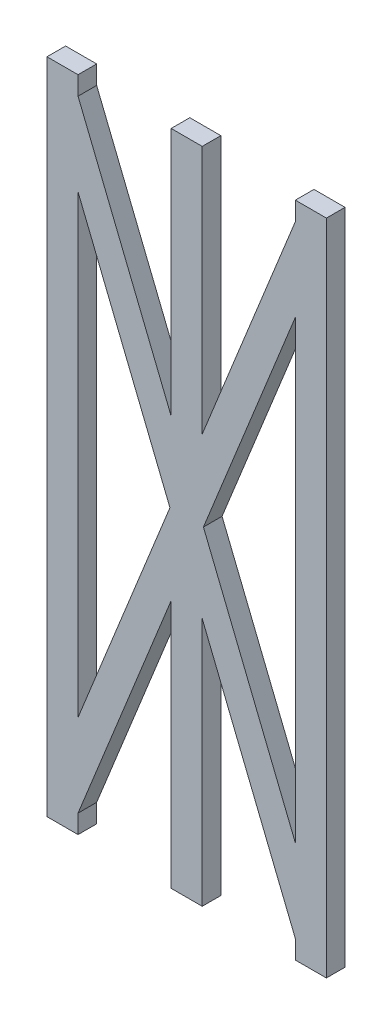
ISO-10303-21;
HEADER;
FILE_DESCRIPTION(('STEP AP214'),'2;1');
FILE_NAME('part.step','',(''),(''),'','','');
FILE_SCHEMA(('AUTOMOTIVE_DESIGN { 1 0 10303 214 1 1 1 1 }'));
ENDSEC;
DATA;
#1=APPLICATION_CONTEXT('core data for automotive mechanical design processes');
#2=APPLICATION_PROTOCOL_DEFINITION('international standard','automotive_design',2000,#1);
#3=PRODUCT_CONTEXT('',#1,'mechanical');
#4=PRODUCT('Part','Part','',(#3));
#5=PRODUCT_RELATED_PRODUCT_CATEGORY('part','',(#4));
#6=PRODUCT_DEFINITION_FORMATION('','',#4);
#7=PRODUCT_DEFINITION_CONTEXT('part definition',#1,'design');
#8=PRODUCT_DEFINITION('design','',#6,#7);
#9=PRODUCT_DEFINITION_SHAPE('','',#8);
#10=(LENGTH_UNIT() NAMED_UNIT(*) SI_UNIT(.MILLI.,.METRE.));
#11=(NAMED_UNIT(*) PLANE_ANGLE_UNIT() SI_UNIT($,.RADIAN.));
#12=(NAMED_UNIT(*) SI_UNIT($,.STERADIAN.) SOLID_ANGLE_UNIT());
#13=UNCERTAINTY_MEASURE_WITH_UNIT(LENGTH_MEASURE(1.E-05),#10,'distance_accuracy_value','');
#14=(GEOMETRIC_REPRESENTATION_CONTEXT(3) GLOBAL_UNCERTAINTY_ASSIGNED_CONTEXT((#13)) GLOBAL_UNIT_ASSIGNED_CONTEXT((#10,
#11,#12)) REPRESENTATION_CONTEXT('',''));
#15=CARTESIAN_POINT('',(0.,0.,0.));
#16=DIRECTION('',(0.,0.,1.));
#17=DIRECTION('',(1.,0.,0.));
#18=AXIS2_PLACEMENT_3D('',#15,#16,#17);
#19=CARTESIAN_POINT('',(35.4310171654556,14.3114678799665,3.));
#20=DIRECTION('',(0.927216502829253,0.374525775990239,0.));
#21=DIRECTION('',(-0.374525775990239,0.927216502829253,0.));
#22=AXIS2_PLACEMENT_3D('',#19,#20,#21);
#23=PLANE('',#22);
#24=DIRECTION('',(0.374525775990239,-0.927216502829253,0.));
#25=VECTOR('',#24,1.);
#26=CARTESIAN_POINT('',(35.4310171654556,14.3114678799665,0.));
#27=LINE('',#26,#25);
#28=CARTESIAN_POINT('',(5.00000000000001,89.6497840187898,0.));
#29=VERTEX_POINT('',#28);
#30=CARTESIAN_POINT('',(19.8037580841458,53.,0.));
#31=VERTEX_POINT('',#30);
#32=EDGE_CURVE('E222',#29,#31,#27,.T.);
#33=ORIENTED_EDGE('',*,*,#32,.T.);
#34=DIRECTION('',(0.,0.,-1.));
#35=VECTOR('',#34,1.);
#36=CARTESIAN_POINT('',(19.8037580841458,53.,3.));
#37=LINE('',#36,#35);
#38=CARTESIAN_POINT('',(19.8037580841458,53.,3.));
#39=VERTEX_POINT('',#38);
#40=EDGE_CURVE('E11',#39,#31,#37,.T.);
#41=ORIENTED_EDGE('',*,*,#40,.F.);
#42=DIRECTION('',(0.374525775990239,-0.927216502829253,0.));
#43=VECTOR('',#42,1.);
#44=CARTESIAN_POINT('',(35.4310171654556,14.3114678799665,3.));
#45=LINE('',#44,#43);
#46=CARTESIAN_POINT('',(5.00000000000001,89.6497840187898,3.));
#47=VERTEX_POINT('',#46);
#48=EDGE_CURVE('E214',#47,#39,#45,.T.);
#49=ORIENTED_EDGE('',*,*,#48,.F.);
#50=DIRECTION('',(0.,0.,-1.));
#51=VECTOR('',#50,1.);
#52=CARTESIAN_POINT('',(5.00000000000001,89.6497840187898,3.));
#53=LINE('',#52,#51);
#54=EDGE_CURVE('E54',#47,#29,#53,.T.);
#55=ORIENTED_EDGE('',*,*,#54,.T.);
#56=EDGE_LOOP('',(#33,#41,#49,#55));
#57=FACE_BOUND('',#56,.T.);
#58=ADVANCED_FACE('F35',(#57),#23,.F.);
#59=CARTESIAN_POINT('',(-1.37922973925097,0.557105149429064,3.));
#60=DIRECTION('',(-0.927216502829253,0.374525775990239,0.));
#61=DIRECTION('',(-0.374525775990239,-0.927216502829253,0.));
#62=AXIS2_PLACEMENT_3D('',#59,#60,#61);
#63=PLANE('',#62);
#64=DIRECTION('',(0.374525775990239,0.927216502829253,0.));
#65=VECTOR('',#64,1.);
#66=CARTESIAN_POINT('',(-1.37922973925097,0.557105149429064,0.));
#67=LINE('',#66,#65);
#68=CARTESIAN_POINT('',(5.00000000000001,16.3502159812102,0.));
#69=VERTEX_POINT('',#68);
#70=EDGE_CURVE('E296',#69,#31,#67,.T.);
#71=ORIENTED_EDGE('',*,*,#70,.F.);
#72=DIRECTION('',(0.,0.,-1.));
#73=VECTOR('',#72,1.);
#74=CARTESIAN_POINT('',(5.00000000000001,16.3502159812102,3.));
#75=LINE('',#74,#73);
#76=CARTESIAN_POINT('',(5.00000000000001,16.3502159812102,3.));
#77=VERTEX_POINT('',#76);
#78=EDGE_CURVE('E45',#77,#69,#75,.T.);
#79=ORIENTED_EDGE('',*,*,#78,.F.);
#80=DIRECTION('',(0.374525775990239,0.927216502829253,0.));
#81=VECTOR('',#80,1.);
#82=CARTESIAN_POINT('',(-1.37922973925097,0.557105149429064,3.));
#83=LINE('',#82,#81);
#84=EDGE_CURVE('E218',#77,#39,#83,.T.);
#85=ORIENTED_EDGE('',*,*,#84,.T.);
#86=ORIENTED_EDGE('',*,*,#40,.T.);
#87=EDGE_LOOP('',(#71,#79,#85,#86));
#88=FACE_BOUND('',#87,.T.);
#89=ADVANCED_FACE('F225',(#88),#63,.T.);
#90=CARTESIAN_POINT('',(40.0670996796019,16.1840967599177,3.));
#91=DIRECTION('',(0.927216502829253,0.374525775990239,0.));
#92=DIRECTION('',(-0.374525775990239,0.927216502829253,0.));
#93=AXIS2_PLACEMENT_3D('',#90,#91,#92);
#94=PLANE('',#93);
#95=DIRECTION('',(0.374525775990239,-0.927216502829253,0.));
#96=VECTOR('',#95,1.);
#97=CARTESIAN_POINT('',(40.0670996796019,16.1840967599177,0.));
#98=LINE('',#97,#96);
#99=CARTESIAN_POINT('',(25.1962419158542,53.,0.));
#100=VERTEX_POINT('',#99);
#101=CARTESIAN_POINT('',(40.,16.3502159812102,0.));
#102=VERTEX_POINT('',#101);
#103=EDGE_CURVE('E289',#100,#102,#98,.T.);
#104=ORIENTED_EDGE('',*,*,#103,.F.);
#105=DIRECTION('',(0.,0.,-1.));
#106=VECTOR('',#105,1.);
#107=CARTESIAN_POINT('',(25.1962419158542,53.,3.));
#108=LINE('',#107,#106);
#109=CARTESIAN_POINT('',(25.1962419158542,53.,3.));
#110=VERTEX_POINT('',#109);
#111=EDGE_CURVE('E299',#110,#100,#108,.T.);
#112=ORIENTED_EDGE('',*,*,#111,.F.);
#113=DIRECTION('',(0.374525775990239,-0.927216502829253,0.));
#114=VECTOR('',#113,1.);
#115=CARTESIAN_POINT('',(40.0670996796019,16.1840967599177,3.));
#116=LINE('',#115,#114);
#117=CARTESIAN_POINT('',(40.,16.3502159812102,3.));
#118=VERTEX_POINT('',#117);
#119=EDGE_CURVE('E409',#110,#118,#116,.T.);
#120=ORIENTED_EDGE('',*,*,#119,.T.);
#121=DIRECTION('',(0.,0.,-1.));
#122=VECTOR('',#121,1.);
#123=CARTESIAN_POINT('',(40.,16.3502159812102,3.));
#124=LINE('',#123,#122);
#125=EDGE_CURVE('E301',#118,#102,#124,.T.);
#126=ORIENTED_EDGE('',*,*,#125,.T.);
#127=EDGE_LOOP('',(#104,#112,#120,#126));
#128=FACE_BOUND('',#127,.T.);
#129=ADVANCED_FACE('F500',(#128),#94,.T.);
#130=CARTESIAN_POINT('',(3.2568527748953,-1.31552373052213,3.));
#131=DIRECTION('',(-0.927216502829252,0.374525775990239,0.));
#132=DIRECTION('',(-0.374525775990239,-0.927216502829253,0.));
#133=AXIS2_PLACEMENT_3D('',#130,#131,#132);
#134=PLANE('',#133);
#135=DIRECTION('',(0.374525775990239,0.927216502829253,0.));
#136=VECTOR('',#135,1.);
#137=CARTESIAN_POINT('',(3.2568527748953,-1.31552373052213,0.));
#138=LINE('',#137,#136);
#139=CARTESIAN_POINT('',(40.,89.6497840187898,0.));
#140=VERTEX_POINT('',#139);
#141=EDGE_CURVE('E292',#100,#140,#138,.T.);
#142=ORIENTED_EDGE('',*,*,#141,.T.);
#143=DIRECTION('',(0.,0.,-1.));
#144=VECTOR('',#143,1.);
#145=CARTESIAN_POINT('',(40.,89.6497840187898,3.));
#146=LINE('',#145,#144);
#147=CARTESIAN_POINT('',(40.,89.6497840187898,3.));
#148=VERTEX_POINT('',#147);
#149=EDGE_CURVE('E303',#148,#140,#146,.T.);
#150=ORIENTED_EDGE('',*,*,#149,.F.);
#151=DIRECTION('',(0.374525775990239,0.927216502829253,0.));
#152=VECTOR('',#151,1.);
#153=CARTESIAN_POINT('',(3.2568527748953,-1.31552373052213,3.));
#154=LINE('',#153,#152);
#155=EDGE_CURVE('E411',#110,#148,#154,.T.);
#156=ORIENTED_EDGE('',*,*,#155,.F.);
#157=ORIENTED_EDGE('',*,*,#111,.T.);
#158=EDGE_LOOP('',(#142,#150,#156,#157));
#159=FACE_BOUND('',#158,.T.);
#160=ADVANCED_FACE('F498',(#159),#134,.F.);
#161=CARTESIAN_POINT('',(40.,0.,3.));
#162=DIRECTION('',(-1.,0.,0.));
#163=DIRECTION('',(0.,0.,1.));
#164=AXIS2_PLACEMENT_3D('',#161,#162,#163);
#165=PLANE('',#164);
#166=DIRECTION('',(0.,1.,0.));
#167=VECTOR('',#166,1.);
#168=CARTESIAN_POINT('',(40.,0.,0.));
#169=LINE('',#168,#167);
#170=CARTESIAN_POINT('',(40.,103.,0.));
#171=VERTEX_POINT('',#170);
#172=CARTESIAN_POINT('',(40.,106.,0.));
#173=VERTEX_POINT('',#172);
#174=EDGE_CURVE('E233',#171,#173,#169,.T.);
#175=ORIENTED_EDGE('',*,*,#174,.F.);
#176=DIRECTION('',(0.,0.,-1.));
#177=VECTOR('',#176,1.);
#178=CARTESIAN_POINT('',(40.,103.,3.));
#179=LINE('',#178,#177);
#180=CARTESIAN_POINT('',(40.,103.,3.));
#181=VERTEX_POINT('',#180);
#182=EDGE_CURVE('E39',#181,#171,#179,.T.);
#183=ORIENTED_EDGE('',*,*,#182,.F.);
#184=DIRECTION('',(0.,1.,0.));
#185=VECTOR('',#184,1.);
#186=CARTESIAN_POINT('',(40.,0.,3.));
#187=LINE('',#186,#185);
#188=CARTESIAN_POINT('',(40.,106.,3.));
#189=VERTEX_POINT('',#188);
#190=EDGE_CURVE('E418',#181,#189,#187,.T.);
#191=ORIENTED_EDGE('',*,*,#190,.T.);
#192=DIRECTION('',(0.,0.,-1.));
#193=VECTOR('',#192,1.);
#194=CARTESIAN_POINT('',(40.,106.,3.));
#195=LINE('',#194,#193);
#196=EDGE_CURVE('E227',#189,#173,#195,.T.);
#197=ORIENTED_EDGE('',*,*,#196,.T.);
#198=EDGE_LOOP('',(#175,#183,#191,#197));
#199=FACE_BOUND('',#198,.T.);
#200=ADVANCED_FACE('F351',(#199),#165,.T.);
#201=CARTESIAN_POINT('',(-1.37922973925097,0.557105149429064,3.));
#202=DIRECTION('',(-0.927216502829253,0.374525775990239,0.));
#203=DIRECTION('',(-0.374525775990239,-0.927216502829253,0.));
#204=AXIS2_PLACEMENT_3D('',#201,#202,#203);
#205=PLANE('',#204);
#206=DIRECTION('',(0.374525775990239,0.927216502829253,0.));
#207=VECTOR('',#206,1.);
#208=CARTESIAN_POINT('',(-1.37922973925097,0.557105149429064,0.));
#209=LINE('',#208,#207);
#210=CARTESIAN_POINT('',(25.,65.8643782776615,0.));
#211=VERTEX_POINT('',#210);
#212=EDGE_CURVE('E236',#211,#171,#209,.T.);
#213=ORIENTED_EDGE('',*,*,#212,.F.);
#214=DIRECTION('',(0.,0.,-1.));
#215=VECTOR('',#214,1.);
#216=CARTESIAN_POINT('',(25.,65.8643782776615,3.));
#217=LINE('',#216,#215);
#218=CARTESIAN_POINT('',(25.,65.8643782776615,3.));
#219=VERTEX_POINT('',#218);
#220=EDGE_CURVE('E342',#219,#211,#217,.T.);
#221=ORIENTED_EDGE('',*,*,#220,.F.);
#222=DIRECTION('',(0.374525775990239,0.927216502829253,0.));
#223=VECTOR('',#222,1.);
#224=CARTESIAN_POINT('',(-1.37922973925097,0.557105149429064,3.));
#225=LINE('',#224,#223);
#226=EDGE_CURVE('E350',#219,#181,#225,.T.);
#227=ORIENTED_EDGE('',*,*,#226,.T.);
#228=ORIENTED_EDGE('',*,*,#182,.T.);
#229=EDGE_LOOP('',(#213,#221,#227,#228));
#230=FACE_BOUND('',#229,.T.);
#231=ADVANCED_FACE('F37',(#230),#205,.T.);
#232=CARTESIAN_POINT('',(25.,0.,3.));
#233=DIRECTION('',(1.,0.,0.));
#234=DIRECTION('',(0.,1.,0.));
#235=AXIS2_PLACEMENT_3D('',#232,#233,#234);
#236=PLANE('',#235);
#237=DIRECTION('',(0.,-1.,0.));
#238=VECTOR('',#237,1.);
#239=CARTESIAN_POINT('',(25.,0.,0.));
#240=LINE('',#239,#238);
#241=CARTESIAN_POINT('',(25.,106.,0.));
#242=VERTEX_POINT('',#241);
#243=EDGE_CURVE('E241',#242,#211,#240,.T.);
#244=ORIENTED_EDGE('',*,*,#243,.F.);
#245=DIRECTION('',(0.,0.,-1.));
#246=VECTOR('',#245,1.);
#247=CARTESIAN_POINT('',(25.,106.,3.));
#248=LINE('',#247,#246);
#249=CARTESIAN_POINT('',(25.,106.,3.));
#250=VERTEX_POINT('',#249);
#251=EDGE_CURVE('E341',#250,#242,#248,.T.);
#252=ORIENTED_EDGE('',*,*,#251,.F.);
#253=DIRECTION('',(0.,-1.,0.));
#254=VECTOR('',#253,1.);
#255=CARTESIAN_POINT('',(25.,0.,3.));
#256=LINE('',#255,#254);
#257=EDGE_CURVE('E360',#250,#219,#256,.T.);
#258=ORIENTED_EDGE('',*,*,#257,.T.);
#259=ORIENTED_EDGE('',*,*,#220,.T.);
#260=EDGE_LOOP('',(#244,#252,#258,#259));
#261=FACE_BOUND('',#260,.T.);
#262=ADVANCED_FACE('F358',(#261),#236,.T.);
#263=CARTESIAN_POINT('',(0.,106.,3.));
#264=DIRECTION('',(0.,1.,0.));
#265=DIRECTION('',(0.,0.,1.));
#266=AXIS2_PLACEMENT_3D('',#263,#264,#265);
#267=PLANE('',#266);
#268=DIRECTION('',(1.,0.,0.));
#269=VECTOR('',#268,1.);
#270=CARTESIAN_POINT('',(0.,106.,0.));
#271=LINE('',#270,#269);
#272=CARTESIAN_POINT('',(20.,106.,0.));
#273=VERTEX_POINT('',#272);
#274=EDGE_CURVE('E244',#273,#242,#271,.T.);
#275=ORIENTED_EDGE('',*,*,#274,.F.);
#276=DIRECTION('',(0.,0.,-1.));
#277=VECTOR('',#276,1.);
#278=CARTESIAN_POINT('',(20.,106.,3.));
#279=LINE('',#278,#277);
#280=CARTESIAN_POINT('',(20.,106.,3.));
#281=VERTEX_POINT('',#280);
#282=EDGE_CURVE('E339',#281,#273,#279,.T.);
#283=ORIENTED_EDGE('',*,*,#282,.F.);
#284=DIRECTION('',(1.,0.,0.));
#285=VECTOR('',#284,1.);
#286=CARTESIAN_POINT('',(0.,106.,3.));
#287=LINE('',#286,#285);
#288=EDGE_CURVE('E366',#281,#250,#287,.T.);
#289=ORIENTED_EDGE('',*,*,#288,.T.);
#290=ORIENTED_EDGE('',*,*,#251,.T.);
#291=EDGE_LOOP('',(#275,#283,#289,#290));
#292=FACE_BOUND('',#291,.T.);
#293=ADVANCED_FACE('F368',(#292),#267,.T.);
#294=CARTESIAN_POINT('',(20.,0.,3.));
#295=DIRECTION('',(1.,0.,0.));
#296=DIRECTION('',(0.,1.,0.));
#297=AXIS2_PLACEMENT_3D('',#294,#295,#296);
#298=PLANE('',#297);
#299=DIRECTION('',(0.,-1.,0.));
#300=VECTOR('',#299,1.);
#301=CARTESIAN_POINT('',(20.,0.,0.));
#302=LINE('',#301,#300);
#303=CARTESIAN_POINT('',(20.,65.8643782776615,0.));
#304=VERTEX_POINT('',#303);
#305=EDGE_CURVE('E247',#273,#304,#302,.T.);
#306=ORIENTED_EDGE('',*,*,#305,.T.);
#307=DIRECTION('',(0.,0.,-1.));
#308=VECTOR('',#307,1.);
#309=CARTESIAN_POINT('',(20.,65.8643782776615,3.));
#310=LINE('',#309,#308);
#311=CARTESIAN_POINT('',(20.,65.8643782776615,3.));
#312=VERTEX_POINT('',#311);
#313=EDGE_CURVE('E337',#312,#304,#310,.T.);
#314=ORIENTED_EDGE('',*,*,#313,.F.);
#315=DIRECTION('',(0.,-1.,0.));
#316=VECTOR('',#315,1.);
#317=CARTESIAN_POINT('',(20.,0.,3.));
#318=LINE('',#317,#316);
#319=EDGE_CURVE('E370',#281,#312,#318,.T.);
#320=ORIENTED_EDGE('',*,*,#319,.F.);
#321=ORIENTED_EDGE('',*,*,#282,.T.);
#322=EDGE_LOOP('',(#306,#314,#320,#321));
#323=FACE_BOUND('',#322,.T.);
#324=ADVANCED_FACE('F455',(#323),#298,.F.);
#325=CARTESIAN_POINT('',(40.0670996796019,16.1840967599177,3.));
#326=DIRECTION('',(0.927216502829253,0.374525775990239,0.));
#327=DIRECTION('',(-0.374525775990239,0.927216502829253,0.));
#328=AXIS2_PLACEMENT_3D('',#325,#326,#327);
#329=PLANE('',#328);
#330=DIRECTION('',(0.374525775990239,-0.927216502829253,0.));
#331=VECTOR('',#330,1.);
#332=CARTESIAN_POINT('',(40.0670996796019,16.1840967599177,0.));
#333=LINE('',#332,#331);
#334=CARTESIAN_POINT('',(5.00000000000001,103.,0.));
#335=VERTEX_POINT('',#334);
#336=EDGE_CURVE('E250',#335,#304,#333,.T.);
#337=ORIENTED_EDGE('',*,*,#336,.F.);
#338=DIRECTION('',(0.,0.,-1.));
#339=VECTOR('',#338,1.);
#340=CARTESIAN_POINT('',(5.00000000000001,103.,3.));
#341=LINE('',#340,#339);
#342=CARTESIAN_POINT('',(5.00000000000001,103.,3.));
#343=VERTEX_POINT('',#342);
#344=EDGE_CURVE('E335',#343,#335,#341,.T.);
#345=ORIENTED_EDGE('',*,*,#344,.F.);
#346=DIRECTION('',(0.374525775990239,-0.927216502829253,0.));
#347=VECTOR('',#346,1.);
#348=CARTESIAN_POINT('',(40.0670996796019,16.1840967599177,3.));
#349=LINE('',#348,#347);
#350=EDGE_CURVE('E372',#343,#312,#349,.T.);
#351=ORIENTED_EDGE('',*,*,#350,.T.);
#352=ORIENTED_EDGE('',*,*,#313,.T.);
#353=EDGE_LOOP('',(#337,#345,#351,#352));
#354=FACE_BOUND('',#353,.T.);
#355=ADVANCED_FACE('F452',(#354),#329,.T.);
#356=CARTESIAN_POINT('',(5.00000000000001,0.,3.));
#357=DIRECTION('',(1.,0.,0.));
#358=DIRECTION('',(0.,1.,0.));
#359=AXIS2_PLACEMENT_3D('',#356,#357,#358);
#360=PLANE('',#359);
#361=DIRECTION('',(0.,-1.,0.));
#362=VECTOR('',#361,1.);
#363=CARTESIAN_POINT('',(5.00000000000001,0.,0.));
#364=LINE('',#363,#362);
#365=CARTESIAN_POINT('',(5.,106.,0.));
#366=VERTEX_POINT('',#365);
#367=EDGE_CURVE('E253',#366,#335,#364,.T.);
#368=ORIENTED_EDGE('',*,*,#367,.F.);
#369=DIRECTION('',(0.,0.,-1.));
#370=VECTOR('',#369,1.);
#371=CARTESIAN_POINT('',(5.,106.,3.));
#372=LINE('',#371,#370);
#373=CARTESIAN_POINT('',(5.,106.,3.));
#374=VERTEX_POINT('',#373);
#375=EDGE_CURVE('E333',#374,#366,#372,.T.);
#376=ORIENTED_EDGE('',*,*,#375,.F.);
#377=DIRECTION('',(0.,-1.,0.));
#378=VECTOR('',#377,1.);
#379=CARTESIAN_POINT('',(5.00000000000001,0.,3.));
#380=LINE('',#379,#378);
#381=EDGE_CURVE('E230',#374,#343,#380,.T.);
#382=ORIENTED_EDGE('',*,*,#381,.T.);
#383=ORIENTED_EDGE('',*,*,#344,.T.);
#384=EDGE_LOOP('',(#368,#376,#382,#383));
#385=FACE_BOUND('',#384,.T.);
#386=ADVANCED_FACE('F448',(#385),#360,.T.);
#387=CARTESIAN_POINT('',(0.,106.,3.));
#388=DIRECTION('',(0.,1.,0.));
#389=DIRECTION('',(0.,0.,1.));
#390=AXIS2_PLACEMENT_3D('',#387,#388,#389);
#391=PLANE('',#390);
#392=DIRECTION('',(1.,0.,0.));
#393=VECTOR('',#392,1.);
#394=CARTESIAN_POINT('',(0.,106.,0.));
#395=LINE('',#394,#393);
#396=CARTESIAN_POINT('',(0.,106.,0.));
#397=VERTEX_POINT('',#396);
#398=EDGE_CURVE('E256',#397,#366,#395,.T.);
#399=ORIENTED_EDGE('',*,*,#398,.F.);
#400=DIRECTION('',(0.,0.,-1.));
#401=VECTOR('',#400,1.);
#402=CARTESIAN_POINT('',(0.,106.,3.));
#403=LINE('',#402,#401);
#404=CARTESIAN_POINT('',(0.,106.,3.));
#405=VERTEX_POINT('',#404);
#406=EDGE_CURVE('E331',#405,#397,#403,.T.);
#407=ORIENTED_EDGE('',*,*,#406,.F.);
#408=DIRECTION('',(1.,0.,0.));
#409=VECTOR('',#408,1.);
#410=CARTESIAN_POINT('',(0.,106.,3.));
#411=LINE('',#410,#409);
#412=EDGE_CURVE('E379',#405,#374,#411,.T.);
#413=ORIENTED_EDGE('',*,*,#412,.T.);
#414=ORIENTED_EDGE('',*,*,#375,.T.);
#415=EDGE_LOOP('',(#399,#407,#413,#414));
#416=FACE_BOUND('',#415,.T.);
#417=ADVANCED_FACE('F444',(#416),#391,.T.);
#418=CARTESIAN_POINT('',(0.,0.,3.));
#419=DIRECTION('',(-1.,0.,0.));
#420=DIRECTION('',(0.,0.,1.));
#421=AXIS2_PLACEMENT_3D('',#418,#419,#420);
#422=PLANE('',#421);
#423=DIRECTION('',(0.,1.,0.));
#424=VECTOR('',#423,1.);
#425=CARTESIAN_POINT('',(0.,0.,0.));
#426=LINE('',#425,#424);
#427=CARTESIAN_POINT('',(0.,0.,0.));
#428=VERTEX_POINT('',#427);
#429=EDGE_CURVE('E261',#428,#397,#426,.T.);
#430=ORIENTED_EDGE('',*,*,#429,.F.);
#431=DIRECTION('',(0.,0.,-1.));
#432=VECTOR('',#431,1.);
#433=CARTESIAN_POINT('',(0.,0.,3.));
#434=LINE('',#433,#432);
#435=CARTESIAN_POINT('',(0.,0.,3.));
#436=VERTEX_POINT('',#435);
#437=EDGE_CURVE('E329',#436,#428,#434,.T.);
#438=ORIENTED_EDGE('',*,*,#437,.F.);
#439=DIRECTION('',(0.,1.,0.));
#440=VECTOR('',#439,1.);
#441=CARTESIAN_POINT('',(0.,0.,3.));
#442=LINE('',#441,#440);
#443=EDGE_CURVE('E382',#436,#405,#442,.T.);
#444=ORIENTED_EDGE('',*,*,#443,.T.);
#445=ORIENTED_EDGE('',*,*,#406,.T.);
#446=EDGE_LOOP('',(#430,#438,#444,#445));
#447=FACE_BOUND('',#446,.T.);
#448=ADVANCED_FACE('F440',(#447),#422,.T.);
#449=CARTESIAN_POINT('',(0.,0.,3.));
#450=DIRECTION('',(0.,-1.,0.));
#451=DIRECTION('',(1.,0.,0.));
#452=AXIS2_PLACEMENT_3D('',#449,#450,#451);
#453=PLANE('',#452);
#454=DIRECTION('',(-1.,0.,0.));
#455=VECTOR('',#454,1.);
#456=CARTESIAN_POINT('',(0.,0.,0.));
#457=LINE('',#456,#455);
#458=CARTESIAN_POINT('',(5.00000000000001,0.,0.));
#459=VERTEX_POINT('',#458);
#460=EDGE_CURVE('E264',#459,#428,#457,.T.);
#461=ORIENTED_EDGE('',*,*,#460,.F.);
#462=DIRECTION('',(0.,0.,-1.));
#463=VECTOR('',#462,1.);
#464=CARTESIAN_POINT('',(5.00000000000001,0.,3.));
#465=LINE('',#464,#463);
#466=CARTESIAN_POINT('',(5.00000000000001,0.,3.));
#467=VERTEX_POINT('',#466);
#468=EDGE_CURVE('E327',#467,#459,#465,.T.);
#469=ORIENTED_EDGE('',*,*,#468,.F.);
#470=DIRECTION('',(-1.,0.,0.));
#471=VECTOR('',#470,1.);
#472=CARTESIAN_POINT('',(0.,0.,3.));
#473=LINE('',#472,#471);
#474=EDGE_CURVE('E385',#467,#436,#473,.T.);
#475=ORIENTED_EDGE('',*,*,#474,.T.);
#476=ORIENTED_EDGE('',*,*,#437,.T.);
#477=EDGE_LOOP('',(#461,#469,#475,#476));
#478=FACE_BOUND('',#477,.T.);
#479=ADVANCED_FACE('F436',(#478),#453,.T.);
#480=CARTESIAN_POINT('',(5.00000000000001,3.00000000000003,0.));
#481=VERTEX_POINT('',#480);
#482=EDGE_CURVE('E258',#481,#459,#364,.T.);
#483=ORIENTED_EDGE('',*,*,#482,.F.);
#484=DIRECTION('',(0.,0.,-1.));
#485=VECTOR('',#484,1.);
#486=CARTESIAN_POINT('',(5.00000000000001,3.00000000000003,3.));
#487=LINE('',#486,#485);
#488=CARTESIAN_POINT('',(5.00000000000001,3.00000000000003,3.));
#489=VERTEX_POINT('',#488);
#490=EDGE_CURVE('E325',#489,#481,#487,.T.);
#491=ORIENTED_EDGE('',*,*,#490,.F.);
#492=EDGE_CURVE('E229',#489,#467,#380,.T.);
#493=ORIENTED_EDGE('',*,*,#492,.T.);
#494=ORIENTED_EDGE('',*,*,#468,.T.);
#495=EDGE_LOOP('',(#483,#491,#493,#494));
#496=FACE_BOUND('',#495,.T.);
#497=ADVANCED_FACE('F430',(#496),#360,.T.);
#498=CARTESIAN_POINT('',(3.2568527748953,-1.31552373052213,3.));
#499=DIRECTION('',(-0.927216502829252,0.374525775990239,0.));
#500=DIRECTION('',(-0.374525775990239,-0.927216502829253,0.));
#501=AXIS2_PLACEMENT_3D('',#498,#499,#500);
#502=PLANE('',#501);
#503=DIRECTION('',(0.374525775990239,0.927216502829253,0.));
#504=VECTOR('',#503,1.);
#505=CARTESIAN_POINT('',(3.2568527748953,-1.31552373052213,0.));
#506=LINE('',#505,#504);
#507=CARTESIAN_POINT('',(20.,40.1356217223385,0.));
#508=VERTEX_POINT('',#507);
#509=EDGE_CURVE('E267',#481,#508,#506,.T.);
#510=ORIENTED_EDGE('',*,*,#509,.T.);
#511=DIRECTION('',(0.,0.,-1.));
#512=VECTOR('',#511,1.);
#513=CARTESIAN_POINT('',(20.,40.1356217223385,3.));
#514=LINE('',#513,#512);
#515=CARTESIAN_POINT('',(20.,40.1356217223385,3.));
#516=VERTEX_POINT('',#515);
#517=EDGE_CURVE('E322',#516,#508,#514,.T.);
#518=ORIENTED_EDGE('',*,*,#517,.F.);
#519=DIRECTION('',(0.374525775990239,0.927216502829253,0.));
#520=VECTOR('',#519,1.);
#521=CARTESIAN_POINT('',(3.2568527748953,-1.31552373052213,3.));
#522=LINE('',#521,#520);
#523=EDGE_CURVE('E388',#489,#516,#522,.T.);
#524=ORIENTED_EDGE('',*,*,#523,.F.);
#525=ORIENTED_EDGE('',*,*,#490,.T.);
#526=EDGE_LOOP('',(#510,#518,#524,#525));
#527=FACE_BOUND('',#526,.T.);
#528=ADVANCED_FACE('F460',(#527),#502,.F.);
#529=CARTESIAN_POINT('',(20.,0.,3.));
#530=DIRECTION('',(1.,0.,0.));
#531=DIRECTION('',(0.,1.,0.));
#532=AXIS2_PLACEMENT_3D('',#529,#530,#531);
#533=PLANE('',#532);
#534=DIRECTION('',(0.,-1.,0.));
#535=VECTOR('',#534,1.);
#536=CARTESIAN_POINT('',(20.,0.,0.));
#537=LINE('',#536,#535);
#538=CARTESIAN_POINT('',(20.,0.,0.));
#539=VERTEX_POINT('',#538);
#540=EDGE_CURVE('E269',#508,#539,#537,.T.);
#541=ORIENTED_EDGE('',*,*,#540,.T.);
#542=DIRECTION('',(0.,0.,-1.));
#543=VECTOR('',#542,1.);
#544=CARTESIAN_POINT('',(20.,0.,3.));
#545=LINE('',#544,#543);
#546=CARTESIAN_POINT('',(20.,0.,3.));
#547=VERTEX_POINT('',#546);
#548=EDGE_CURVE('E319',#547,#539,#545,.T.);
#549=ORIENTED_EDGE('',*,*,#548,.F.);
#550=DIRECTION('',(0.,-1.,0.));
#551=VECTOR('',#550,1.);
#552=CARTESIAN_POINT('',(20.,0.,3.));
#553=LINE('',#552,#551);
#554=EDGE_CURVE('E390',#516,#547,#553,.T.);
#555=ORIENTED_EDGE('',*,*,#554,.F.);
#556=ORIENTED_EDGE('',*,*,#517,.T.);
#557=EDGE_LOOP('',(#541,#549,#555,#556));
#558=FACE_BOUND('',#557,.T.);
#559=ADVANCED_FACE('F462',(#558),#533,.F.);
#560=CARTESIAN_POINT('',(0.,0.,3.));
#561=DIRECTION('',(0.,1.,0.));
#562=DIRECTION('',(0.,0.,1.));
#563=AXIS2_PLACEMENT_3D('',#560,#561,#562);
#564=PLANE('',#563);
#565=DIRECTION('',(1.,0.,0.));
#566=VECTOR('',#565,1.);
#567=CARTESIAN_POINT('',(0.,0.,0.));
#568=LINE('',#567,#566);
#569=CARTESIAN_POINT('',(25.,0.,0.));
#570=VERTEX_POINT('',#569);
#571=EDGE_CURVE('E271',#539,#570,#568,.T.);
#572=ORIENTED_EDGE('',*,*,#571,.T.);
#573=DIRECTION('',(0.,0.,-1.));
#574=VECTOR('',#573,1.);
#575=CARTESIAN_POINT('',(25.,0.,3.));
#576=LINE('',#575,#574);
#577=CARTESIAN_POINT('',(25.,0.,3.));
#578=VERTEX_POINT('',#577);
#579=EDGE_CURVE('E317',#578,#570,#576,.T.);
#580=ORIENTED_EDGE('',*,*,#579,.F.);
#581=DIRECTION('',(1.,0.,0.));
#582=VECTOR('',#581,1.);
#583=CARTESIAN_POINT('',(0.,0.,3.));
#584=LINE('',#583,#582);
#585=EDGE_CURVE('E392',#547,#578,#584,.T.);
#586=ORIENTED_EDGE('',*,*,#585,.F.);
#587=ORIENTED_EDGE('',*,*,#548,.T.);
#588=EDGE_LOOP('',(#572,#580,#586,#587));
#589=FACE_BOUND('',#588,.T.);
#590=ADVANCED_FACE('F467',(#589),#564,.F.);
#591=CARTESIAN_POINT('',(25.,0.,3.));
#592=DIRECTION('',(1.,0.,0.));
#593=DIRECTION('',(0.,1.,0.));
#594=AXIS2_PLACEMENT_3D('',#591,#592,#593);
#595=PLANE('',#594);
#596=DIRECTION('',(0.,-1.,0.));
#597=VECTOR('',#596,1.);
#598=CARTESIAN_POINT('',(25.,0.,0.));
#599=LINE('',#598,#597);
#600=CARTESIAN_POINT('',(25.,40.1356217223386,0.));
#601=VERTEX_POINT('',#600);
#602=EDGE_CURVE('E274',#601,#570,#599,.T.);
#603=ORIENTED_EDGE('',*,*,#602,.F.);
#604=DIRECTION('',(0.,0.,-1.));
#605=VECTOR('',#604,1.);
#606=CARTESIAN_POINT('',(25.,40.1356217223386,3.));
#607=LINE('',#606,#605);
#608=CARTESIAN_POINT('',(25.,40.1356217223386,3.));
#609=VERTEX_POINT('',#608);
#610=EDGE_CURVE('E315',#609,#601,#607,.T.);
#611=ORIENTED_EDGE('',*,*,#610,.F.);
#612=DIRECTION('',(0.,-1.,0.));
#613=VECTOR('',#612,1.);
#614=CARTESIAN_POINT('',(25.,0.,3.));
#615=LINE('',#614,#613);
#616=EDGE_CURVE('E394',#609,#578,#615,.T.);
#617=ORIENTED_EDGE('',*,*,#616,.T.);
#618=ORIENTED_EDGE('',*,*,#579,.T.);
#619=EDGE_LOOP('',(#603,#611,#617,#618));
#620=FACE_BOUND('',#619,.T.);
#621=ADVANCED_FACE('F474',(#620),#595,.T.);
#622=CARTESIAN_POINT('',(35.4310171654556,14.3114678799665,3.));
#623=DIRECTION('',(0.927216502829253,0.374525775990239,0.));
#624=DIRECTION('',(-0.374525775990239,0.927216502829253,0.));
#625=AXIS2_PLACEMENT_3D('',#622,#623,#624);
#626=PLANE('',#625);
#627=DIRECTION('',(0.374525775990239,-0.927216502829253,0.));
#628=VECTOR('',#627,1.);
#629=CARTESIAN_POINT('',(35.4310171654556,14.3114678799665,0.));
#630=LINE('',#629,#628);
#631=CARTESIAN_POINT('',(40.,3.,0.));
#632=VERTEX_POINT('',#631);
#633=EDGE_CURVE('E277',#601,#632,#630,.T.);
#634=ORIENTED_EDGE('',*,*,#633,.T.);
#635=DIRECTION('',(0.,0.,-1.));
#636=VECTOR('',#635,1.);
#637=CARTESIAN_POINT('',(40.,3.,3.));
#638=LINE('',#637,#636);
#639=CARTESIAN_POINT('',(40.,3.,3.));
#640=VERTEX_POINT('',#639);
#641=EDGE_CURVE('E313',#640,#632,#638,.T.);
#642=ORIENTED_EDGE('',*,*,#641,.F.);
#643=DIRECTION('',(0.374525775990239,-0.927216502829253,0.));
#644=VECTOR('',#643,1.);
#645=CARTESIAN_POINT('',(35.4310171654556,14.3114678799665,3.));
#646=LINE('',#645,#644);
#647=EDGE_CURVE('E397',#609,#640,#646,.T.);
#648=ORIENTED_EDGE('',*,*,#647,.F.);
#649=ORIENTED_EDGE('',*,*,#610,.T.);
#650=EDGE_LOOP('',(#634,#642,#648,#649));
#651=FACE_BOUND('',#650,.T.);
#652=ADVANCED_FACE('F477',(#651),#626,.F.);
#653=CARTESIAN_POINT('',(40.,0.,0.));
#654=VERTEX_POINT('',#653);
#655=EDGE_CURVE('E238',#654,#632,#169,.T.);
#656=ORIENTED_EDGE('',*,*,#655,.F.);
#657=DIRECTION('',(0.,0.,-1.));
#658=VECTOR('',#657,1.);
#659=CARTESIAN_POINT('',(40.,0.,3.));
#660=LINE('',#659,#658);
#661=CARTESIAN_POINT('',(40.,0.,3.));
#662=VERTEX_POINT('',#661);
#663=EDGE_CURVE('E311',#662,#654,#660,.T.);
#664=ORIENTED_EDGE('',*,*,#663,.F.);
#665=EDGE_CURVE('E399',#662,#640,#187,.T.);
#666=ORIENTED_EDGE('',*,*,#665,.T.);
#667=ORIENTED_EDGE('',*,*,#641,.T.);
#668=EDGE_LOOP('',(#656,#664,#666,#667));
#669=FACE_BOUND('',#668,.T.);
#670=ADVANCED_FACE('F481',(#669),#165,.T.);
#671=CARTESIAN_POINT('',(0.,0.,3.));
#672=DIRECTION('',(0.,-1.,0.));
#673=DIRECTION('',(1.,0.,0.));
#674=AXIS2_PLACEMENT_3D('',#671,#672,#673);
#675=PLANE('',#674);
#676=DIRECTION('',(-1.,0.,0.));
#677=VECTOR('',#676,1.);
#678=CARTESIAN_POINT('',(0.,0.,0.));
#679=LINE('',#678,#677);
#680=CARTESIAN_POINT('',(45.,0.,0.));
#681=VERTEX_POINT('',#680);
#682=EDGE_CURVE('E280',#681,#654,#679,.T.);
#683=ORIENTED_EDGE('',*,*,#682,.F.);
#684=DIRECTION('',(0.,0.,-1.));
#685=VECTOR('',#684,1.);
#686=CARTESIAN_POINT('',(45.,0.,3.));
#687=LINE('',#686,#685);
#688=CARTESIAN_POINT('',(45.,0.,3.));
#689=VERTEX_POINT('',#688);
#690=EDGE_CURVE('E309',#689,#681,#687,.T.);
#691=ORIENTED_EDGE('',*,*,#690,.F.);
#692=DIRECTION('',(-1.,0.,0.));
#693=VECTOR('',#692,1.);
#694=CARTESIAN_POINT('',(0.,0.,3.));
#695=LINE('',#694,#693);
#696=EDGE_CURVE('E400',#689,#662,#695,.T.);
#697=ORIENTED_EDGE('',*,*,#696,.T.);
#698=ORIENTED_EDGE('',*,*,#663,.T.);
#699=EDGE_LOOP('',(#683,#691,#697,#698));
#700=FACE_BOUND('',#699,.T.);
#701=ADVANCED_FACE('F486',(#700),#675,.T.);
#702=CARTESIAN_POINT('',(45.,0.,3.));
#703=DIRECTION('',(1.,0.,0.));
#704=DIRECTION('',(0.,0.,-1.));
#705=AXIS2_PLACEMENT_3D('',#702,#703,#704);
#706=PLANE('',#705);
#707=DIRECTION('',(0.,-1.,0.));
#708=VECTOR('',#707,1.);
#709=CARTESIAN_POINT('',(45.,0.,0.));
#710=LINE('',#709,#708);
#711=CARTESIAN_POINT('',(45.,106.,0.));
#712=VERTEX_POINT('',#711);
#713=EDGE_CURVE('E283',#712,#681,#710,.T.);
#714=ORIENTED_EDGE('',*,*,#713,.F.);
#715=DIRECTION('',(0.,0.,-1.));
#716=VECTOR('',#715,1.);
#717=CARTESIAN_POINT('',(45.,106.,3.));
#718=LINE('',#717,#716);
#719=CARTESIAN_POINT('',(45.,106.,3.));
#720=VERTEX_POINT('',#719);
#721=EDGE_CURVE('E307',#720,#712,#718,.T.);
#722=ORIENTED_EDGE('',*,*,#721,.F.);
#723=DIRECTION('',(0.,-1.,0.));
#724=VECTOR('',#723,1.);
#725=CARTESIAN_POINT('',(45.,0.,3.));
#726=LINE('',#725,#724);
#727=EDGE_CURVE('E403',#720,#689,#726,.T.);
#728=ORIENTED_EDGE('',*,*,#727,.T.);
#729=ORIENTED_EDGE('',*,*,#690,.T.);
#730=EDGE_LOOP('',(#714,#722,#728,#729));
#731=FACE_BOUND('',#730,.T.);
#732=ADVANCED_FACE('F489',(#731),#706,.T.);
#733=EDGE_CURVE('E237',#102,#140,#169,.T.);
#734=ORIENTED_EDGE('',*,*,#733,.F.);
#735=ORIENTED_EDGE('',*,*,#125,.F.);
#736=EDGE_CURVE('E220',#118,#148,#187,.T.);
#737=ORIENTED_EDGE('',*,*,#736,.T.);
#738=ORIENTED_EDGE('',*,*,#149,.T.);
#739=EDGE_LOOP('',(#734,#735,#737,#738));
#740=FACE_BOUND('',#739,.T.);
#741=ADVANCED_FACE('F496',(#740),#165,.T.);
#742=CARTESIAN_POINT('',(0.,106.,3.));
#743=DIRECTION('',(0.,1.,0.));
#744=DIRECTION('',(0.,0.,1.));
#745=AXIS2_PLACEMENT_3D('',#742,#743,#744);
#746=PLANE('',#745);
#747=DIRECTION('',(1.,0.,0.));
#748=VECTOR('',#747,1.);
#749=CARTESIAN_POINT('',(0.,106.,0.));
#750=LINE('',#749,#748);
#751=EDGE_CURVE('E286',#173,#712,#750,.T.);
#752=ORIENTED_EDGE('',*,*,#751,.F.);
#753=ORIENTED_EDGE('',*,*,#196,.F.);
#754=DIRECTION('',(1.,0.,0.));
#755=VECTOR('',#754,1.);
#756=CARTESIAN_POINT('',(0.,106.,3.));
#757=LINE('',#756,#755);
#758=EDGE_CURVE('E406',#189,#720,#757,.T.);
#759=ORIENTED_EDGE('',*,*,#758,.T.);
#760=ORIENTED_EDGE('',*,*,#721,.T.);
#761=EDGE_LOOP('',(#752,#753,#759,#760));
#762=FACE_BOUND('',#761,.T.);
#763=ADVANCED_FACE('F491',(#762),#746,.T.);
#764=EDGE_CURVE('E257',#29,#69,#364,.T.);
#765=ORIENTED_EDGE('',*,*,#764,.F.);
#766=ORIENTED_EDGE('',*,*,#54,.F.);
#767=EDGE_CURVE('E219',#47,#77,#380,.T.);
#768=ORIENTED_EDGE('',*,*,#767,.T.);
#769=ORIENTED_EDGE('',*,*,#78,.T.);
#770=EDGE_LOOP('',(#765,#766,#768,#769));
#771=FACE_BOUND('',#770,.T.);
#772=ADVANCED_FACE('F502',(#771),#360,.T.);
#773=CARTESIAN_POINT('',(0.,0.,3.));
#774=DIRECTION('',(0.,0.,1.));
#775=DIRECTION('',(1.,0.,0.));
#776=AXIS2_PLACEMENT_3D('',#773,#774,#775);
#777=PLANE('',#776);
#778=ORIENTED_EDGE('',*,*,#190,.F.);
#779=ORIENTED_EDGE('',*,*,#226,.F.);
#780=ORIENTED_EDGE('',*,*,#257,.F.);
#781=ORIENTED_EDGE('',*,*,#288,.F.);
#782=ORIENTED_EDGE('',*,*,#319,.T.);
#783=ORIENTED_EDGE('',*,*,#350,.F.);
#784=ORIENTED_EDGE('',*,*,#381,.F.);
#785=ORIENTED_EDGE('',*,*,#412,.F.);
#786=ORIENTED_EDGE('',*,*,#443,.F.);
#787=ORIENTED_EDGE('',*,*,#474,.F.);
#788=ORIENTED_EDGE('',*,*,#492,.F.);
#789=ORIENTED_EDGE('',*,*,#523,.T.);
#790=ORIENTED_EDGE('',*,*,#554,.T.);
#791=ORIENTED_EDGE('',*,*,#585,.T.);
#792=ORIENTED_EDGE('',*,*,#616,.F.);
#793=ORIENTED_EDGE('',*,*,#647,.T.);
#794=ORIENTED_EDGE('',*,*,#665,.F.);
#795=ORIENTED_EDGE('',*,*,#696,.F.);
#796=ORIENTED_EDGE('',*,*,#727,.F.);
#797=ORIENTED_EDGE('',*,*,#758,.F.);
#798=EDGE_LOOP('',(#778,#779,#780,#781,#782,#783,#784,#785,#786,#787,#788,#789,#790,#791,#792,
#793,#794,#795,#796,#797));
#799=FACE_BOUND('',#798,.T.);
#800=ORIENTED_EDGE('',*,*,#119,.F.);
#801=ORIENTED_EDGE('',*,*,#155,.T.);
#802=ORIENTED_EDGE('',*,*,#736,.F.);
#803=EDGE_LOOP('',(#800,#801,#802));
#804=FACE_BOUND('',#803,.T.);
#805=ORIENTED_EDGE('',*,*,#48,.T.);
#806=ORIENTED_EDGE('',*,*,#84,.F.);
#807=ORIENTED_EDGE('',*,*,#767,.F.);
#808=EDGE_LOOP('',(#805,#806,#807));
#809=FACE_BOUND('',#808,.T.);
#810=ADVANCED_FACE('F216',(#799,#804,#809),#777,.T.);
#811=CARTESIAN_POINT('',(0.,0.,0.));
#812=DIRECTION('',(0.,0.,1.));
#813=DIRECTION('',(1.,0.,0.));
#814=AXIS2_PLACEMENT_3D('',#811,#812,#813);
#815=PLANE('',#814);
#816=ORIENTED_EDGE('',*,*,#174,.T.);
#817=ORIENTED_EDGE('',*,*,#751,.T.);
#818=ORIENTED_EDGE('',*,*,#713,.T.);
#819=ORIENTED_EDGE('',*,*,#682,.T.);
#820=ORIENTED_EDGE('',*,*,#655,.T.);
#821=ORIENTED_EDGE('',*,*,#633,.F.);
#822=ORIENTED_EDGE('',*,*,#602,.T.);
#823=ORIENTED_EDGE('',*,*,#571,.F.);
#824=ORIENTED_EDGE('',*,*,#540,.F.);
#825=ORIENTED_EDGE('',*,*,#509,.F.);
#826=ORIENTED_EDGE('',*,*,#482,.T.);
#827=ORIENTED_EDGE('',*,*,#460,.T.);
#828=ORIENTED_EDGE('',*,*,#429,.T.);
#829=ORIENTED_EDGE('',*,*,#398,.T.);
#830=ORIENTED_EDGE('',*,*,#367,.T.);
#831=ORIENTED_EDGE('',*,*,#336,.T.);
#832=ORIENTED_EDGE('',*,*,#305,.F.);
#833=ORIENTED_EDGE('',*,*,#274,.T.);
#834=ORIENTED_EDGE('',*,*,#243,.T.);
#835=ORIENTED_EDGE('',*,*,#212,.T.);
#836=EDGE_LOOP('',(#816,#817,#818,#819,#820,#821,#822,#823,#824,#825,#826,#827,#828,#829,#830,
#831,#832,#833,#834,#835));
#837=FACE_BOUND('',#836,.T.);
#838=ORIENTED_EDGE('',*,*,#103,.T.);
#839=ORIENTED_EDGE('',*,*,#733,.T.);
#840=ORIENTED_EDGE('',*,*,#141,.F.);
#841=EDGE_LOOP('',(#838,#839,#840));
#842=FACE_BOUND('',#841,.T.);
#843=ORIENTED_EDGE('',*,*,#32,.F.);
#844=ORIENTED_EDGE('',*,*,#764,.T.);
#845=ORIENTED_EDGE('',*,*,#70,.T.);
#846=EDGE_LOOP('',(#843,#844,#845));
#847=FACE_BOUND('',#846,.T.);
#848=ADVANCED_FACE('F354',(#837,#842,#847),#815,.F.);
#849=CLOSED_SHELL('',(#58,#89,#129,#160,#200,#231,#262,#293,#324,#355,#386,#417,#448,#479,#497,
#528,#559,#590,#621,#652,#670,#701,#732,#741,#763,#772,#810,#848));
#850=MANIFOLD_SOLID_BREP('B2',#849);
#851=ADVANCED_BREP_SHAPE_REPRESENTATION('',(#18,#850),#14);
#852=SHAPE_DEFINITION_REPRESENTATION(#9,#851);
ENDSEC;
END-ISO-10303-21;
